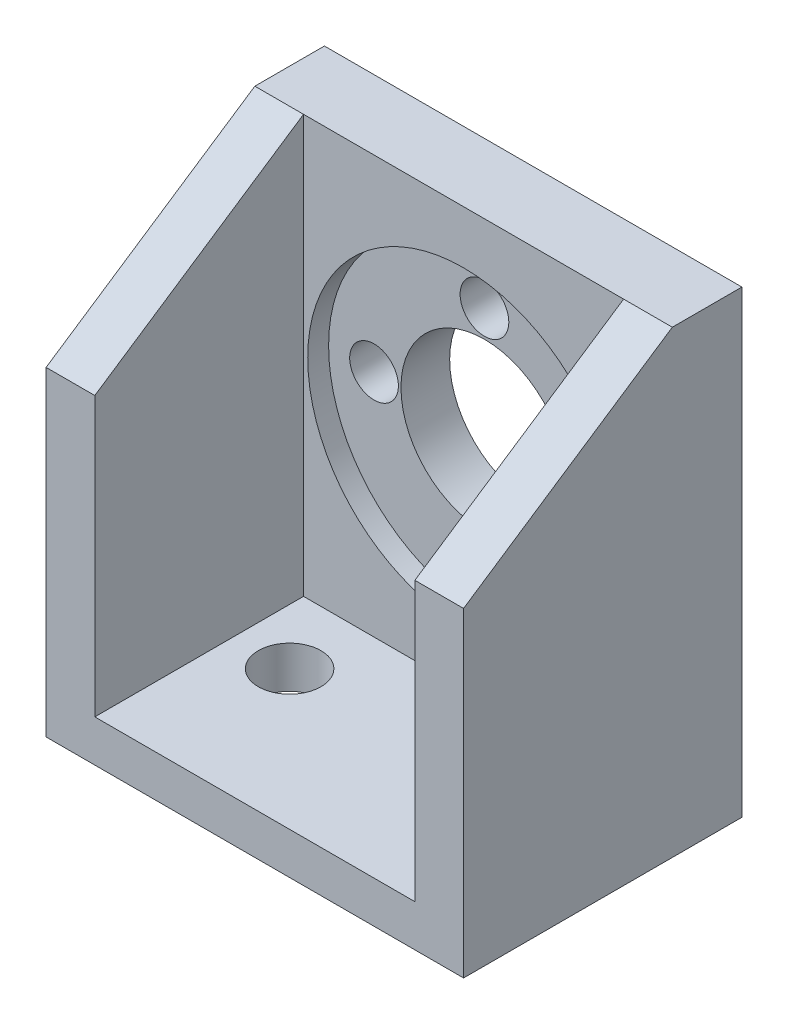
ISO-10303-21;
HEADER;
FILE_DESCRIPTION(('STEP AP214'),'2;1');
FILE_NAME('part.step','',(''),(''),'','','');
FILE_SCHEMA(('AUTOMOTIVE_DESIGN { 1 0 10303 214 1 1 1 1 }'));
ENDSEC;
DATA;
#1=APPLICATION_CONTEXT('core data for automotive mechanical design processes');
#2=APPLICATION_PROTOCOL_DEFINITION('international standard','automotive_design',2000,#1);
#3=PRODUCT_CONTEXT('',#1,'mechanical');
#4=PRODUCT('Part','Part','',(#3));
#5=PRODUCT_RELATED_PRODUCT_CATEGORY('part','',(#4));
#6=PRODUCT_DEFINITION_FORMATION('','',#4);
#7=PRODUCT_DEFINITION_CONTEXT('part definition',#1,'design');
#8=PRODUCT_DEFINITION('design','',#6,#7);
#9=PRODUCT_DEFINITION_SHAPE('','',#8);
#10=(LENGTH_UNIT() NAMED_UNIT(*) SI_UNIT(.MILLI.,.METRE.));
#11=(NAMED_UNIT(*) PLANE_ANGLE_UNIT() SI_UNIT($,.RADIAN.));
#12=(NAMED_UNIT(*) SI_UNIT($,.STERADIAN.) SOLID_ANGLE_UNIT());
#13=UNCERTAINTY_MEASURE_WITH_UNIT(LENGTH_MEASURE(1.E-05),#10,'distance_accuracy_value','');
#14=(GEOMETRIC_REPRESENTATION_CONTEXT(3) GLOBAL_UNCERTAINTY_ASSIGNED_CONTEXT((#13)) GLOBAL_UNIT_ASSIGNED_CONTEXT((#10,
#11,#12)) REPRESENTATION_CONTEXT('',''));
#15=CARTESIAN_POINT('',(0.,0.,0.));
#16=DIRECTION('',(0.,0.,1.));
#17=DIRECTION('',(1.,0.,0.));
#18=AXIS2_PLACEMENT_3D('',#15,#16,#17);
#19=CARTESIAN_POINT('',(0.,1.5,0.));
#20=DIRECTION('',(0.,0.,1.));
#21=DIRECTION('',(1.,0.,0.));
#22=AXIS2_PLACEMENT_3D('',#19,#20,#21);
#23=CYLINDRICAL_SURFACE('',#22,6.);
#24=CARTESIAN_POINT('',(0.,1.5,0.));
#25=DIRECTION('',(0.,0.,1.));
#26=DIRECTION('',(1.,0.,0.));
#27=AXIS2_PLACEMENT_3D('',#24,#25,#26);
#28=CIRCLE('',#27,6.);
#29=CARTESIAN_POINT('',(6.,1.5,0.));
#30=VERTEX_POINT('',#29);
#31=EDGE_CURVE('E219',#30,#30,#28,.T.);
#32=ORIENTED_EDGE('',*,*,#31,.F.);
#33=EDGE_LOOP('',(#32));
#34=FACE_BOUND('',#33,.T.);
#35=CARTESIAN_POINT('',(0.,1.5,3.5));
#36=DIRECTION('',(0.,0.,1.));
#37=DIRECTION('',(1.,0.,0.));
#38=AXIS2_PLACEMENT_3D('',#35,#36,#37);
#39=CIRCLE('',#38,6.);
#40=CARTESIAN_POINT('',(6.,1.5,3.5));
#41=VERTEX_POINT('',#40);
#42=EDGE_CURVE('E235',#41,#41,#39,.F.);
#43=ORIENTED_EDGE('',*,*,#42,.F.);
#44=EDGE_LOOP('',(#43));
#45=FACE_BOUND('',#44,.T.);
#46=ADVANCED_FACE('F34',(#34,#45),#23,.F.);
#47=CARTESIAN_POINT('',(0.,9.43405,0.));
#48=DIRECTION('',(0.,0.,1.));
#49=DIRECTION('',(1.,0.,0.));
#50=AXIS2_PLACEMENT_3D('',#47,#48,#49);
#51=CYLINDRICAL_SURFACE('',#50,1.75);
#52=CARTESIAN_POINT('',(0.,9.43405,0.));
#53=DIRECTION('',(0.,0.,1.));
#54=DIRECTION('',(1.,0.,0.));
#55=AXIS2_PLACEMENT_3D('',#52,#53,#54);
#56=CIRCLE('',#55,1.75);
#57=CARTESIAN_POINT('',(1.75,9.43405,0.));
#58=VERTEX_POINT('',#57);
#59=EDGE_CURVE('E223',#58,#58,#56,.T.);
#60=ORIENTED_EDGE('',*,*,#59,.F.);
#61=EDGE_LOOP('',(#60));
#62=FACE_BOUND('',#61,.T.);
#63=CARTESIAN_POINT('',(0.,9.43405,3.5));
#64=DIRECTION('',(0.,0.,1.));
#65=DIRECTION('',(1.,0.,0.));
#66=AXIS2_PLACEMENT_3D('',#63,#64,#65);
#67=CIRCLE('',#66,1.75);
#68=CARTESIAN_POINT('',(1.75,9.43405,3.5));
#69=VERTEX_POINT('',#68);
#70=EDGE_CURVE('E238',#69,#69,#67,.F.);
#71=ORIENTED_EDGE('',*,*,#70,.F.);
#72=EDGE_LOOP('',(#71));
#73=FACE_BOUND('',#72,.T.);
#74=ADVANCED_FACE('F293',(#62,#73),#51,.F.);
#75=CARTESIAN_POINT('',(-7.93405,1.5,0.));
#76=DIRECTION('',(0.,0.,1.));
#77=DIRECTION('',(1.,0.,0.));
#78=AXIS2_PLACEMENT_3D('',#75,#76,#77);
#79=CYLINDRICAL_SURFACE('',#78,1.75);
#80=CARTESIAN_POINT('',(-7.93405,1.5,0.));
#81=DIRECTION('',(0.,0.,1.));
#82=DIRECTION('',(1.,0.,0.));
#83=AXIS2_PLACEMENT_3D('',#80,#81,#82);
#84=CIRCLE('',#83,1.75);
#85=CARTESIAN_POINT('',(-6.18405,1.5,0.));
#86=VERTEX_POINT('',#85);
#87=EDGE_CURVE('E226',#86,#86,#84,.T.);
#88=ORIENTED_EDGE('',*,*,#87,.F.);
#89=EDGE_LOOP('',(#88));
#90=FACE_BOUND('',#89,.T.);
#91=CARTESIAN_POINT('',(-7.93405,1.5,3.5));
#92=DIRECTION('',(0.,0.,1.));
#93=DIRECTION('',(1.,0.,0.));
#94=AXIS2_PLACEMENT_3D('',#91,#92,#93);
#95=CIRCLE('',#94,1.75);
#96=CARTESIAN_POINT('',(-6.18405,1.5,3.5));
#97=VERTEX_POINT('',#96);
#98=EDGE_CURVE('E241',#97,#97,#95,.F.);
#99=ORIENTED_EDGE('',*,*,#98,.F.);
#100=EDGE_LOOP('',(#99));
#101=FACE_BOUND('',#100,.T.);
#102=ADVANCED_FACE('F299',(#90,#101),#79,.F.);
#103=CARTESIAN_POINT('',(7.93405,1.5,0.));
#104=DIRECTION('',(0.,0.,1.));
#105=DIRECTION('',(1.,0.,0.));
#106=AXIS2_PLACEMENT_3D('',#103,#104,#105);
#107=CYLINDRICAL_SURFACE('',#106,1.75);
#108=CARTESIAN_POINT('',(7.93405,1.5,0.));
#109=DIRECTION('',(0.,0.,1.));
#110=DIRECTION('',(1.,0.,0.));
#111=AXIS2_PLACEMENT_3D('',#108,#109,#110);
#112=CIRCLE('',#111,1.75);
#113=CARTESIAN_POINT('',(9.68405,1.5,0.));
#114=VERTEX_POINT('',#113);
#115=EDGE_CURVE('E229',#114,#114,#112,.T.);
#116=ORIENTED_EDGE('',*,*,#115,.F.);
#117=EDGE_LOOP('',(#116));
#118=FACE_BOUND('',#117,.T.);
#119=CARTESIAN_POINT('',(7.93405,1.5,3.5));
#120=DIRECTION('',(0.,0.,1.));
#121=DIRECTION('',(1.,0.,0.));
#122=AXIS2_PLACEMENT_3D('',#119,#120,#121);
#123=CIRCLE('',#122,1.75);
#124=CARTESIAN_POINT('',(9.68405,1.5,3.5));
#125=VERTEX_POINT('',#124);
#126=EDGE_CURVE('E244',#125,#125,#123,.F.);
#127=ORIENTED_EDGE('',*,*,#126,.F.);
#128=EDGE_LOOP('',(#127));
#129=FACE_BOUND('',#128,.T.);
#130=ADVANCED_FACE('F343',(#118,#129),#107,.F.);
#131=CARTESIAN_POINT('',(0.,-6.43405,0.));
#132=DIRECTION('',(0.,0.,1.));
#133=DIRECTION('',(1.,0.,0.));
#134=AXIS2_PLACEMENT_3D('',#131,#132,#133);
#135=CYLINDRICAL_SURFACE('',#134,1.75);
#136=CARTESIAN_POINT('',(0.,-6.43405,0.));
#137=DIRECTION('',(0.,0.,1.));
#138=DIRECTION('',(1.,0.,0.));
#139=AXIS2_PLACEMENT_3D('',#136,#137,#138);
#140=CIRCLE('',#139,1.75);
#141=CARTESIAN_POINT('',(1.75,-6.43405,0.));
#142=VERTEX_POINT('',#141);
#143=EDGE_CURVE('E232',#142,#142,#140,.T.);
#144=ORIENTED_EDGE('',*,*,#143,.F.);
#145=EDGE_LOOP('',(#144));
#146=FACE_BOUND('',#145,.T.);
#147=CARTESIAN_POINT('',(0.,-6.43405,3.5));
#148=DIRECTION('',(0.,0.,1.));
#149=DIRECTION('',(1.,0.,0.));
#150=AXIS2_PLACEMENT_3D('',#147,#148,#149);
#151=CIRCLE('',#150,1.75);
#152=CARTESIAN_POINT('',(1.75,-6.43405,3.5));
#153=VERTEX_POINT('',#152);
#154=EDGE_CURVE('E38',#153,#153,#151,.F.);
#155=ORIENTED_EDGE('',*,*,#154,.F.);
#156=EDGE_LOOP('',(#155));
#157=FACE_BOUND('',#156,.T.);
#158=ADVANCED_FACE('F318',(#146,#157),#135,.F.);
#159=CARTESIAN_POINT('',(0.,0.,5.));
#160=DIRECTION('',(0.,0.,-1.));
#161=DIRECTION('',(-1.,0.,0.));
#162=AXIS2_PLACEMENT_3D('',#159,#160,#161);
#163=PLANE('',#162);
#164=CARTESIAN_POINT('',(0.,1.5,5.));
#165=DIRECTION('',(0.,0.,1.));
#166=DIRECTION('',(1.,0.,0.));
#167=AXIS2_PLACEMENT_3D('',#164,#165,#166);
#168=CIRCLE('',#167,11.1989);
#169=CARTESIAN_POINT('',(11.1989,1.5,5.));
#170=VERTEX_POINT('',#169);
#171=EDGE_CURVE('E247',#170,#170,#168,.T.);
#172=ORIENTED_EDGE('',*,*,#171,.F.);
#173=EDGE_LOOP('',(#172));
#174=FACE_BOUND('',#173,.T.);
#175=DIRECTION('',(0.,1.,0.));
#176=VECTOR('',#175,1.);
#177=CARTESIAN_POINT('',(-11.5,-13.5,5.));
#178=LINE('',#177,#176);
#179=CARTESIAN_POINT('',(-11.5,-13.5,5.));
#180=VERTEX_POINT('',#179);
#181=CARTESIAN_POINT('',(-11.5,16.5,5.));
#182=VERTEX_POINT('',#181);
#183=EDGE_CURVE('E172',#180,#182,#178,.T.);
#184=ORIENTED_EDGE('',*,*,#183,.F.);
#185=DIRECTION('',(-1.,0.,0.));
#186=VECTOR('',#185,1.);
#187=CARTESIAN_POINT('',(11.5,-13.5,5.));
#188=LINE('',#187,#186);
#189=CARTESIAN_POINT('',(11.5,-13.5,5.));
#190=VERTEX_POINT('',#189);
#191=EDGE_CURVE('E183',#190,#180,#188,.T.);
#192=ORIENTED_EDGE('',*,*,#191,.F.);
#193=DIRECTION('',(0.,-1.,0.));
#194=VECTOR('',#193,1.);
#195=CARTESIAN_POINT('',(11.5,16.5,5.));
#196=LINE('',#195,#194);
#197=CARTESIAN_POINT('',(11.5,16.5,5.));
#198=VERTEX_POINT('',#197);
#199=EDGE_CURVE('E139',#198,#190,#196,.T.);
#200=ORIENTED_EDGE('',*,*,#199,.F.);
#201=DIRECTION('',(-1.,0.,0.));
#202=VECTOR('',#201,1.);
#203=CARTESIAN_POINT('',(-15.,16.5,5.));
#204=LINE('',#203,#202);
#205=EDGE_CURVE('E135',#198,#182,#204,.T.);
#206=ORIENTED_EDGE('',*,*,#205,.T.);
#207=EDGE_LOOP('',(#184,#192,#200,#206));
#208=FACE_BOUND('',#207,.T.);
#209=ADVANCED_FACE('F196',(#174,#208),#163,.F.);
#210=CARTESIAN_POINT('',(15.,-16.5,5.));
#211=DIRECTION('',(-1.,0.,0.));
#212=DIRECTION('',(0.,0.,1.));
#213=AXIS2_PLACEMENT_3D('',#210,#211,#212);
#214=PLANE('',#213);
#215=DIRECTION('',(0.,0.,-1.));
#216=VECTOR('',#215,1.);
#217=CARTESIAN_POINT('',(15.,16.5,5.));
#218=LINE('',#217,#216);
#219=CARTESIAN_POINT('',(15.,16.5,5.));
#220=VERTEX_POINT('',#219);
#221=CARTESIAN_POINT('',(15.,16.5,0.));
#222=VERTEX_POINT('',#221);
#223=EDGE_CURVE('E43',#220,#222,#218,.T.);
#224=ORIENTED_EDGE('',*,*,#223,.F.);
#225=DIRECTION('',(0.,0.554700196225229,-0.832050294337843));
#226=VECTOR('',#225,1.);
#227=CARTESIAN_POINT('',(15.,6.5,20.));
#228=LINE('',#227,#226);
#229=CARTESIAN_POINT('',(15.,6.5,20.));
#230=VERTEX_POINT('',#229);
#231=EDGE_CURVE('E121',#230,#220,#228,.T.);
#232=ORIENTED_EDGE('',*,*,#231,.F.);
#233=DIRECTION('',(0.,1.,0.));
#234=VECTOR('',#233,1.);
#235=CARTESIAN_POINT('',(15.,-16.5,20.));
#236=LINE('',#235,#234);
#237=CARTESIAN_POINT('',(15.,-16.5,20.));
#238=VERTEX_POINT('',#237);
#239=EDGE_CURVE('E159',#238,#230,#236,.T.);
#240=ORIENTED_EDGE('',*,*,#239,.F.);
#241=DIRECTION('',(0.,0.,-1.));
#242=VECTOR('',#241,1.);
#243=CARTESIAN_POINT('',(15.,-16.5,5.));
#244=LINE('',#243,#242);
#245=CARTESIAN_POINT('',(15.,-16.5,0.));
#246=VERTEX_POINT('',#245);
#247=EDGE_CURVE('E131',#238,#246,#244,.T.);
#248=ORIENTED_EDGE('',*,*,#247,.T.);
#249=DIRECTION('',(0.,1.,0.));
#250=VECTOR('',#249,1.);
#251=CARTESIAN_POINT('',(15.,-16.5,0.));
#252=LINE('',#251,#250);
#253=EDGE_CURVE('E146',#246,#222,#252,.T.);
#254=ORIENTED_EDGE('',*,*,#253,.T.);
#255=EDGE_LOOP('',(#224,#232,#240,#248,#254));
#256=FACE_BOUND('',#255,.T.);
#257=ADVANCED_FACE('F36',(#256),#214,.F.);
#258=CARTESIAN_POINT('',(-15.,16.5,5.));
#259=DIRECTION('',(0.,-1.,0.));
#260=DIRECTION('',(0.,0.,-1.));
#261=AXIS2_PLACEMENT_3D('',#258,#259,#260);
#262=PLANE('',#261);
#263=DIRECTION('',(0.,0.,-1.));
#264=VECTOR('',#263,1.);
#265=CARTESIAN_POINT('',(-15.,16.5,5.));
#266=LINE('',#265,#264);
#267=CARTESIAN_POINT('',(-15.,16.5,5.));
#268=VERTEX_POINT('',#267);
#269=CARTESIAN_POINT('',(-15.,16.5,0.));
#270=VERTEX_POINT('',#269);
#271=EDGE_CURVE('E117',#268,#270,#266,.T.);
#272=ORIENTED_EDGE('',*,*,#271,.F.);
#273=DIRECTION('',(1.,0.,0.));
#274=VECTOR('',#273,1.);
#275=CARTESIAN_POINT('',(-15.,16.5,5.));
#276=LINE('',#275,#274);
#277=EDGE_CURVE('E103',#268,#182,#276,.T.);
#278=ORIENTED_EDGE('',*,*,#277,.T.);
#279=ORIENTED_EDGE('',*,*,#205,.F.);
#280=EDGE_CURVE('E112',#198,#220,#276,.T.);
#281=ORIENTED_EDGE('',*,*,#280,.T.);
#282=ORIENTED_EDGE('',*,*,#223,.T.);
#283=DIRECTION('',(-1.,0.,0.));
#284=VECTOR('',#283,1.);
#285=CARTESIAN_POINT('',(-15.,16.5,0.));
#286=LINE('',#285,#284);
#287=EDGE_CURVE('E125',#222,#270,#286,.T.);
#288=ORIENTED_EDGE('',*,*,#287,.T.);
#289=EDGE_LOOP('',(#272,#278,#279,#281,#282,#288));
#290=FACE_BOUND('',#289,.T.);
#291=ADVANCED_FACE('F123',(#290),#262,.F.);
#292=CARTESIAN_POINT('',(-15.,-16.5,5.));
#293=DIRECTION('',(1.,0.,0.));
#294=DIRECTION('',(0.,0.,-1.));
#295=AXIS2_PLACEMENT_3D('',#292,#293,#294);
#296=PLANE('',#295);
#297=DIRECTION('',(0.,-1.,0.));
#298=VECTOR('',#297,1.);
#299=CARTESIAN_POINT('',(-15.,16.5,20.));
#300=LINE('',#299,#298);
#301=CARTESIAN_POINT('',(-15.,6.5,20.));
#302=VERTEX_POINT('',#301);
#303=CARTESIAN_POINT('',(-15.,-16.5,20.));
#304=VERTEX_POINT('',#303);
#305=EDGE_CURVE('E120',#302,#304,#300,.T.);
#306=ORIENTED_EDGE('',*,*,#305,.F.);
#307=DIRECTION('',(0.,0.554700196225229,-0.832050294337843));
#308=VECTOR('',#307,1.);
#309=CARTESIAN_POINT('',(-15.,6.5,20.));
#310=LINE('',#309,#308);
#311=EDGE_CURVE('E57',#302,#268,#310,.T.);
#312=ORIENTED_EDGE('',*,*,#311,.T.);
#313=ORIENTED_EDGE('',*,*,#271,.T.);
#314=DIRECTION('',(0.,-1.,0.));
#315=VECTOR('',#314,1.);
#316=CARTESIAN_POINT('',(-15.,-16.5,0.));
#317=LINE('',#316,#315);
#318=CARTESIAN_POINT('',(-15.,-16.5,0.));
#319=VERTEX_POINT('',#318);
#320=EDGE_CURVE('E150',#270,#319,#317,.T.);
#321=ORIENTED_EDGE('',*,*,#320,.T.);
#322=DIRECTION('',(0.,0.,-1.));
#323=VECTOR('',#322,1.);
#324=CARTESIAN_POINT('',(-15.,-16.5,5.));
#325=LINE('',#324,#323);
#326=EDGE_CURVE('E127',#304,#319,#325,.T.);
#327=ORIENTED_EDGE('',*,*,#326,.F.);
#328=EDGE_LOOP('',(#306,#312,#313,#321,#327));
#329=FACE_BOUND('',#328,.T.);
#330=ADVANCED_FACE('F116',(#329),#296,.F.);
#331=CARTESIAN_POINT('',(-15.,-16.5,5.));
#332=DIRECTION('',(0.,1.,0.));
#333=DIRECTION('',(0.,0.,1.));
#334=AXIS2_PLACEMENT_3D('',#331,#332,#333);
#335=PLANE('',#334);
#336=CARTESIAN_POINT('',(7.5,-16.5,10.));
#337=DIRECTION('',(0.,1.,0.));
#338=DIRECTION('',(-1.,0.,0.));
#339=AXIS2_PLACEMENT_3D('',#336,#337,#338);
#340=CIRCLE('',#339,2.25);
#341=CARTESIAN_POINT('',(5.25,-16.5,10.));
#342=VERTEX_POINT('',#341);
#343=EDGE_CURVE('E257',#342,#342,#340,.T.);
#344=ORIENTED_EDGE('',*,*,#343,.T.);
#345=EDGE_LOOP('',(#344));
#346=FACE_BOUND('',#345,.T.);
#347=CARTESIAN_POINT('',(-7.5,-16.5,10.));
#348=DIRECTION('',(0.,1.,0.));
#349=DIRECTION('',(-1.,0.,0.));
#350=AXIS2_PLACEMENT_3D('',#347,#348,#349);
#351=CIRCLE('',#350,2.25);
#352=CARTESIAN_POINT('',(-9.75,-16.5,10.));
#353=VERTEX_POINT('',#352);
#354=EDGE_CURVE('E251',#353,#353,#351,.T.);
#355=ORIENTED_EDGE('',*,*,#354,.T.);
#356=EDGE_LOOP('',(#355));
#357=FACE_BOUND('',#356,.T.);
#358=DIRECTION('',(1.,0.,0.));
#359=VECTOR('',#358,1.);
#360=CARTESIAN_POINT('',(-15.,-16.5,0.));
#361=LINE('',#360,#359);
#362=EDGE_CURVE('E138',#319,#246,#361,.T.);
#363=ORIENTED_EDGE('',*,*,#362,.T.);
#364=ORIENTED_EDGE('',*,*,#247,.F.);
#365=DIRECTION('',(1.,0.,0.));
#366=VECTOR('',#365,1.);
#367=CARTESIAN_POINT('',(-15.,-16.5,20.));
#368=LINE('',#367,#366);
#369=EDGE_CURVE('E167',#304,#238,#368,.T.);
#370=ORIENTED_EDGE('',*,*,#369,.F.);
#371=ORIENTED_EDGE('',*,*,#326,.T.);
#372=EDGE_LOOP('',(#363,#364,#370,#371));
#373=FACE_BOUND('',#372,.T.);
#374=ADVANCED_FACE('F166',(#346,#357,#373),#335,.F.);
#375=CARTESIAN_POINT('',(0.,0.,0.));
#376=DIRECTION('',(0.,0.,-1.));
#377=DIRECTION('',(-1.,0.,0.));
#378=AXIS2_PLACEMENT_3D('',#375,#376,#377);
#379=PLANE('',#378);
#380=ORIENTED_EDGE('',*,*,#143,.T.);
#381=EDGE_LOOP('',(#380));
#382=FACE_BOUND('',#381,.T.);
#383=ORIENTED_EDGE('',*,*,#115,.T.);
#384=EDGE_LOOP('',(#383));
#385=FACE_BOUND('',#384,.T.);
#386=ORIENTED_EDGE('',*,*,#87,.T.);
#387=EDGE_LOOP('',(#386));
#388=FACE_BOUND('',#387,.T.);
#389=ORIENTED_EDGE('',*,*,#59,.T.);
#390=EDGE_LOOP('',(#389));
#391=FACE_BOUND('',#390,.T.);
#392=ORIENTED_EDGE('',*,*,#31,.T.);
#393=EDGE_LOOP('',(#392));
#394=FACE_BOUND('',#393,.T.);
#395=ORIENTED_EDGE('',*,*,#253,.F.);
#396=ORIENTED_EDGE('',*,*,#362,.F.);
#397=ORIENTED_EDGE('',*,*,#320,.F.);
#398=ORIENTED_EDGE('',*,*,#287,.F.);
#399=EDGE_LOOP('',(#395,#396,#397,#398));
#400=FACE_BOUND('',#399,.T.);
#401=ADVANCED_FACE('F165',(#382,#385,#388,#391,#394,#400),#379,.T.);
#402=CARTESIAN_POINT('',(11.5,16.5,20.));
#403=DIRECTION('',(1.,0.,0.));
#404=DIRECTION('',(0.,1.,0.));
#405=AXIS2_PLACEMENT_3D('',#402,#403,#404);
#406=PLANE('',#405);
#407=DIRECTION('',(0.,-1.,0.));
#408=VECTOR('',#407,1.);
#409=CARTESIAN_POINT('',(11.5,16.5,20.));
#410=LINE('',#409,#408);
#411=CARTESIAN_POINT('',(11.5,6.5,20.));
#412=VERTEX_POINT('',#411);
#413=CARTESIAN_POINT('',(11.5,-13.5,20.));
#414=VERTEX_POINT('',#413);
#415=EDGE_CURVE('E170',#412,#414,#410,.T.);
#416=ORIENTED_EDGE('',*,*,#415,.F.);
#417=DIRECTION('',(0.,0.554700196225229,-0.832050294337844));
#418=VECTOR('',#417,1.);
#419=CARTESIAN_POINT('',(11.5,9.57692307692308,15.3846153846154));
#420=LINE('',#419,#418);
#421=EDGE_CURVE('E49',#412,#198,#420,.T.);
#422=ORIENTED_EDGE('',*,*,#421,.T.);
#423=ORIENTED_EDGE('',*,*,#199,.T.);
#424=DIRECTION('',(0.,0.,-1.));
#425=VECTOR('',#424,1.);
#426=CARTESIAN_POINT('',(11.5,-13.5,20.));
#427=LINE('',#426,#425);
#428=EDGE_CURVE('E144',#414,#190,#427,.T.);
#429=ORIENTED_EDGE('',*,*,#428,.F.);
#430=EDGE_LOOP('',(#416,#422,#423,#429));
#431=FACE_BOUND('',#430,.T.);
#432=ADVANCED_FACE('F206',(#431),#406,.F.);
#433=CARTESIAN_POINT('',(11.5,-13.5,20.));
#434=DIRECTION('',(0.,-1.,0.));
#435=DIRECTION('',(1.,0.,0.));
#436=AXIS2_PLACEMENT_3D('',#433,#434,#435);
#437=PLANE('',#436);
#438=CARTESIAN_POINT('',(7.5,-13.5,10.));
#439=DIRECTION('',(0.,1.,0.));
#440=DIRECTION('',(-1.,0.,0.));
#441=AXIS2_PLACEMENT_3D('',#438,#439,#440);
#442=CIRCLE('',#441,2.25);
#443=CARTESIAN_POINT('',(5.25,-13.5,10.));
#444=VERTEX_POINT('',#443);
#445=EDGE_CURVE('E260',#444,#444,#442,.T.);
#446=ORIENTED_EDGE('',*,*,#445,.F.);
#447=EDGE_LOOP('',(#446));
#448=FACE_BOUND('',#447,.T.);
#449=CARTESIAN_POINT('',(-7.5,-13.5,10.));
#450=DIRECTION('',(0.,1.,0.));
#451=DIRECTION('',(-1.,0.,0.));
#452=AXIS2_PLACEMENT_3D('',#449,#450,#451);
#453=CIRCLE('',#452,2.25);
#454=CARTESIAN_POINT('',(-9.75,-13.5,10.));
#455=VERTEX_POINT('',#454);
#456=EDGE_CURVE('E254',#455,#455,#453,.T.);
#457=ORIENTED_EDGE('',*,*,#456,.F.);
#458=EDGE_LOOP('',(#457));
#459=FACE_BOUND('',#458,.T.);
#460=ORIENTED_EDGE('',*,*,#191,.T.);
#461=DIRECTION('',(0.,0.,-1.));
#462=VECTOR('',#461,1.);
#463=CARTESIAN_POINT('',(-11.5,-13.5,20.));
#464=LINE('',#463,#462);
#465=CARTESIAN_POINT('',(-11.5,-13.5,20.));
#466=VERTEX_POINT('',#465);
#467=EDGE_CURVE('E182',#466,#180,#464,.T.);
#468=ORIENTED_EDGE('',*,*,#467,.F.);
#469=DIRECTION('',(-1.,0.,0.));
#470=VECTOR('',#469,1.);
#471=CARTESIAN_POINT('',(11.5,-13.5,20.));
#472=LINE('',#471,#470);
#473=EDGE_CURVE('E177',#414,#466,#472,.T.);
#474=ORIENTED_EDGE('',*,*,#473,.F.);
#475=ORIENTED_EDGE('',*,*,#428,.T.);
#476=EDGE_LOOP('',(#460,#468,#474,#475));
#477=FACE_BOUND('',#476,.T.);
#478=ADVANCED_FACE('F201',(#448,#459,#477),#437,.F.);
#479=CARTESIAN_POINT('',(-11.5,-13.5,20.));
#480=DIRECTION('',(-1.,0.,0.));
#481=DIRECTION('',(0.,0.,1.));
#482=AXIS2_PLACEMENT_3D('',#479,#480,#481);
#483=PLANE('',#482);
#484=ORIENTED_EDGE('',*,*,#183,.T.);
#485=DIRECTION('',(0.,-0.554700196225229,0.832050294337844));
#486=VECTOR('',#485,1.);
#487=CARTESIAN_POINT('',(-11.5,0.346153846153842,29.2307692307692));
#488=LINE('',#487,#486);
#489=CARTESIAN_POINT('',(-11.5,6.5,20.));
#490=VERTEX_POINT('',#489);
#491=EDGE_CURVE('E106',#182,#490,#488,.T.);
#492=ORIENTED_EDGE('',*,*,#491,.T.);
#493=DIRECTION('',(0.,1.,0.));
#494=VECTOR('',#493,1.);
#495=CARTESIAN_POINT('',(-11.5,-13.5,20.));
#496=LINE('',#495,#494);
#497=EDGE_CURVE('E179',#466,#490,#496,.T.);
#498=ORIENTED_EDGE('',*,*,#497,.F.);
#499=ORIENTED_EDGE('',*,*,#467,.T.);
#500=EDGE_LOOP('',(#484,#492,#498,#499));
#501=FACE_BOUND('',#500,.T.);
#502=ADVANCED_FACE('F192',(#501),#483,.F.);
#503=CARTESIAN_POINT('',(0.,0.,20.));
#504=DIRECTION('',(0.,0.,1.));
#505=DIRECTION('',(1.,0.,0.));
#506=AXIS2_PLACEMENT_3D('',#503,#504,#505);
#507=PLANE('',#506);
#508=DIRECTION('',(1.,0.,0.));
#509=VECTOR('',#508,1.);
#510=CARTESIAN_POINT('',(-15.,6.5,20.));
#511=LINE('',#510,#509);
#512=EDGE_CURVE('E111',#302,#490,#511,.T.);
#513=ORIENTED_EDGE('',*,*,#512,.F.);
#514=ORIENTED_EDGE('',*,*,#305,.T.);
#515=ORIENTED_EDGE('',*,*,#369,.T.);
#516=ORIENTED_EDGE('',*,*,#239,.T.);
#517=DIRECTION('',(1.,0.,0.));
#518=VECTOR('',#517,1.);
#519=CARTESIAN_POINT('',(0.,6.5,20.));
#520=LINE('',#519,#518);
#521=EDGE_CURVE('E11',#412,#230,#520,.T.);
#522=ORIENTED_EDGE('',*,*,#521,.F.);
#523=ORIENTED_EDGE('',*,*,#415,.T.);
#524=ORIENTED_EDGE('',*,*,#473,.T.);
#525=ORIENTED_EDGE('',*,*,#497,.T.);
#526=EDGE_LOOP('',(#513,#514,#515,#516,#522,#523,#524,#525));
#527=FACE_BOUND('',#526,.T.);
#528=ADVANCED_FACE('F309',(#527),#507,.T.);
#529=CARTESIAN_POINT('',(-15.,6.5,20.));
#530=DIRECTION('',(0.,-0.832050294337843,-0.554700196225229));
#531=DIRECTION('',(0.,0.554700196225229,-0.832050294337844));
#532=AXIS2_PLACEMENT_3D('',#529,#530,#531);
#533=PLANE('',#532);
#534=ORIENTED_EDGE('',*,*,#521,.T.);
#535=ORIENTED_EDGE('',*,*,#231,.T.);
#536=ORIENTED_EDGE('',*,*,#280,.F.);
#537=ORIENTED_EDGE('',*,*,#421,.F.);
#538=EDGE_LOOP('',(#534,#535,#536,#537));
#539=FACE_BOUND('',#538,.T.);
#540=ADVANCED_FACE('F306',(#539),#533,.F.);
#541=ORIENTED_EDGE('',*,*,#277,.F.);
#542=ORIENTED_EDGE('',*,*,#311,.F.);
#543=ORIENTED_EDGE('',*,*,#512,.T.);
#544=ORIENTED_EDGE('',*,*,#491,.F.);
#545=EDGE_LOOP('',(#541,#542,#543,#544));
#546=FACE_BOUND('',#545,.T.);
#547=ADVANCED_FACE('F104',(#546),#533,.F.);
#548=CARTESIAN_POINT('',(0.,1.5,3.5));
#549=DIRECTION('',(0.,0.,1.));
#550=DIRECTION('',(1.,0.,0.));
#551=AXIS2_PLACEMENT_3D('',#548,#549,#550);
#552=PLANE('',#551);
#553=CARTESIAN_POINT('',(0.,1.5,3.5));
#554=DIRECTION('',(0.,0.,1.));
#555=DIRECTION('',(1.,0.,0.));
#556=AXIS2_PLACEMENT_3D('',#553,#554,#555);
#557=CIRCLE('',#556,11.1989);
#558=CARTESIAN_POINT('',(11.1989,1.5,3.5));
#559=VERTEX_POINT('',#558);
#560=EDGE_CURVE('E250',#559,#559,#557,.T.);
#561=ORIENTED_EDGE('',*,*,#560,.T.);
#562=EDGE_LOOP('',(#561));
#563=FACE_BOUND('',#562,.T.);
#564=ORIENTED_EDGE('',*,*,#154,.T.);
#565=EDGE_LOOP('',(#564));
#566=FACE_BOUND('',#565,.T.);
#567=ORIENTED_EDGE('',*,*,#126,.T.);
#568=EDGE_LOOP('',(#567));
#569=FACE_BOUND('',#568,.T.);
#570=ORIENTED_EDGE('',*,*,#98,.T.);
#571=EDGE_LOOP('',(#570));
#572=FACE_BOUND('',#571,.T.);
#573=ORIENTED_EDGE('',*,*,#70,.T.);
#574=EDGE_LOOP('',(#573));
#575=FACE_BOUND('',#574,.T.);
#576=ORIENTED_EDGE('',*,*,#42,.T.);
#577=EDGE_LOOP('',(#576));
#578=FACE_BOUND('',#577,.T.);
#579=ADVANCED_FACE('F287',(#563,#566,#569,#572,#575,#578),#552,.T.);
#580=CARTESIAN_POINT('',(0.,1.5,3.5));
#581=DIRECTION('',(0.,0.,1.));
#582=DIRECTION('',(1.,0.,0.));
#583=AXIS2_PLACEMENT_3D('',#580,#581,#582);
#584=CYLINDRICAL_SURFACE('',#583,11.1989);
#585=ORIENTED_EDGE('',*,*,#560,.F.);
#586=EDGE_LOOP('',(#585));
#587=FACE_BOUND('',#586,.T.);
#588=ORIENTED_EDGE('',*,*,#171,.T.);
#589=EDGE_LOOP('',(#588));
#590=FACE_BOUND('',#589,.T.);
#591=ADVANCED_FACE('F281',(#587,#590),#584,.F.);
#592=CARTESIAN_POINT('',(-7.5,-16.5,10.));
#593=DIRECTION('',(0.,1.,0.));
#594=DIRECTION('',(-1.,0.,0.));
#595=AXIS2_PLACEMENT_3D('',#592,#593,#594);
#596=CYLINDRICAL_SURFACE('',#595,2.25);
#597=ORIENTED_EDGE('',*,*,#354,.F.);
#598=EDGE_LOOP('',(#597));
#599=FACE_BOUND('',#598,.T.);
#600=ORIENTED_EDGE('',*,*,#456,.T.);
#601=EDGE_LOOP('',(#600));
#602=FACE_BOUND('',#601,.T.);
#603=ADVANCED_FACE('F271',(#599,#602),#596,.F.);
#604=CARTESIAN_POINT('',(7.5,-16.5,10.));
#605=DIRECTION('',(0.,1.,0.));
#606=DIRECTION('',(-1.,0.,0.));
#607=AXIS2_PLACEMENT_3D('',#604,#605,#606);
#608=CYLINDRICAL_SURFACE('',#607,2.25);
#609=ORIENTED_EDGE('',*,*,#343,.F.);
#610=EDGE_LOOP('',(#609));
#611=FACE_BOUND('',#610,.T.);
#612=ORIENTED_EDGE('',*,*,#445,.T.);
#613=EDGE_LOOP('',(#612));
#614=FACE_BOUND('',#613,.T.);
#615=ADVANCED_FACE('F268',(#611,#614),#608,.F.);
#616=CLOSED_SHELL('',(#46,#74,#102,#130,#158,#209,#257,#291,#330,#374,#401,#432,#478,#502,#528,
#540,#547,#579,#591,#603,#615));
#617=MANIFOLD_SOLID_BREP('B2',#616);
#618=ADVANCED_BREP_SHAPE_REPRESENTATION('',(#18,#617),#14);
#619=SHAPE_DEFINITION_REPRESENTATION(#9,#618);
ENDSEC;
END-ISO-10303-21;
